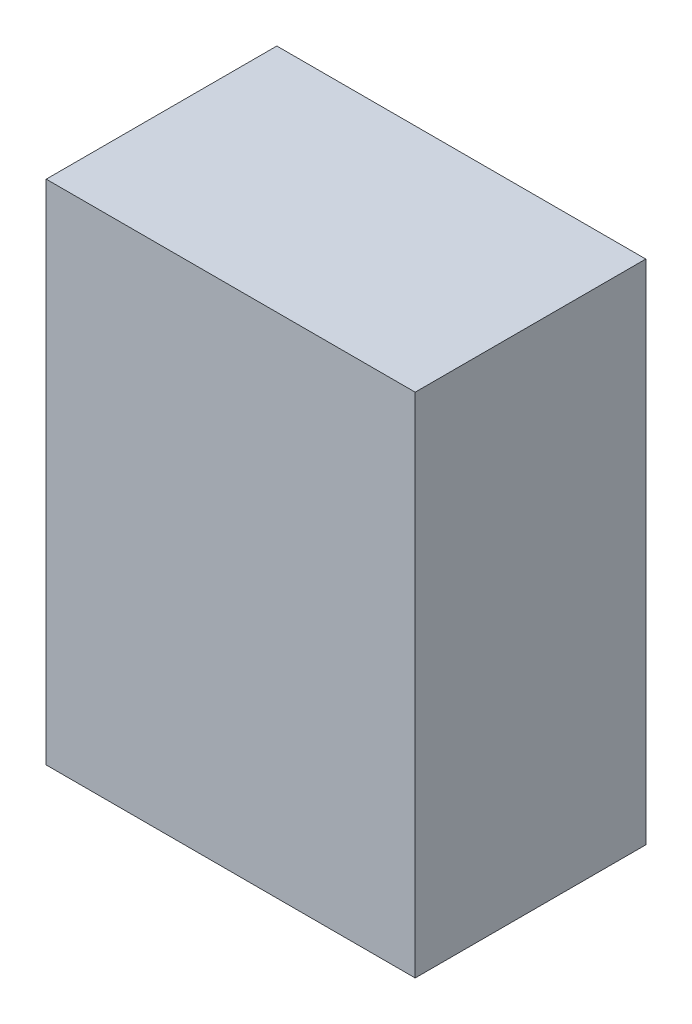
ISO-10303-21;
HEADER;
FILE_DESCRIPTION(('STEP AP214'),'2;1');
FILE_NAME('part.step','',(''),(''),'','','');
FILE_SCHEMA(('AUTOMOTIVE_DESIGN { 1 0 10303 214 1 1 1 1 }'));
ENDSEC;
DATA;
#1=APPLICATION_CONTEXT('core data for automotive mechanical design processes');
#2=APPLICATION_PROTOCOL_DEFINITION('international standard','automotive_design',2000,#1);
#3=PRODUCT_CONTEXT('',#1,'mechanical');
#4=PRODUCT('Part','Part','',(#3));
#5=PRODUCT_RELATED_PRODUCT_CATEGORY('part','',(#4));
#6=PRODUCT_DEFINITION_FORMATION('','',#4);
#7=PRODUCT_DEFINITION_CONTEXT('part definition',#1,'design');
#8=PRODUCT_DEFINITION('design','',#6,#7);
#9=PRODUCT_DEFINITION_SHAPE('','',#8);
#10=(LENGTH_UNIT() NAMED_UNIT(*) SI_UNIT(.MILLI.,.METRE.));
#11=(NAMED_UNIT(*) PLANE_ANGLE_UNIT() SI_UNIT($,.RADIAN.));
#12=(NAMED_UNIT(*) SI_UNIT($,.STERADIAN.) SOLID_ANGLE_UNIT());
#13=UNCERTAINTY_MEASURE_WITH_UNIT(LENGTH_MEASURE(1.E-05),#10,'distance_accuracy_value','');
#14=(GEOMETRIC_REPRESENTATION_CONTEXT(3) GLOBAL_UNCERTAINTY_ASSIGNED_CONTEXT((#13)) GLOBAL_UNIT_ASSIGNED_CONTEXT((#10,
#11,#12)) REPRESENTATION_CONTEXT('',''));
#15=CARTESIAN_POINT('',(0.,0.,0.));
#16=DIRECTION('',(0.,0.,1.));
#17=DIRECTION('',(1.,0.,0.));
#18=AXIS2_PLACEMENT_3D('',#15,#16,#17);
#19=CARTESIAN_POINT('',(-0.7999984,1.10000034,1.00000054));
#20=DIRECTION('',(0.,0.,1.));
#21=DIRECTION('',(1.,0.,0.));
#22=AXIS2_PLACEMENT_3D('',#19,#20,#21);
#23=PLANE('',#22);
#24=DIRECTION('',(0.,1.,0.));
#25=VECTOR('',#24,1.);
#26=CARTESIAN_POINT('',(0.80000094,1.10000034,1.00000054));
#27=LINE('',#26,#25);
#28=CARTESIAN_POINT('',(0.80000094,1.10000034,1.00000054));
#29=VERTEX_POINT('',#28);
#30=CARTESIAN_POINT('',(0.80000094,-1.10000034,1.00000054));
#31=VERTEX_POINT('',#30);
#32=EDGE_CURVE('E51',#29,#31,#27,.F.);
#33=ORIENTED_EDGE('',*,*,#32,.F.);
#34=DIRECTION('',(1.,0.,0.));
#35=VECTOR('',#34,1.);
#36=CARTESIAN_POINT('',(-0.7999984,1.10000034,1.00000054));
#37=LINE('',#36,#35);
#38=CARTESIAN_POINT('',(-0.7999984,1.10000034,1.00000054));
#39=VERTEX_POINT('',#38);
#40=EDGE_CURVE('E18',#29,#39,#37,.F.);
#41=ORIENTED_EDGE('',*,*,#40,.T.);
#42=DIRECTION('',(0.,1.,0.));
#43=VECTOR('',#42,1.);
#44=CARTESIAN_POINT('',(-0.7999984,-1.10000034,1.00000054));
#45=LINE('',#44,#43);
#46=CARTESIAN_POINT('',(-0.7999984,-1.10000034,1.00000054));
#47=VERTEX_POINT('',#46);
#48=EDGE_CURVE('E65',#47,#39,#45,.T.);
#49=ORIENTED_EDGE('',*,*,#48,.F.);
#50=DIRECTION('',(1.,0.,0.));
#51=VECTOR('',#50,1.);
#52=CARTESIAN_POINT('',(0.80000094,-1.10000034,1.00000054));
#53=LINE('',#52,#51);
#54=EDGE_CURVE('E56',#31,#47,#53,.F.);
#55=ORIENTED_EDGE('',*,*,#54,.F.);
#56=EDGE_LOOP('',(#33,#41,#49,#55));
#57=FACE_BOUND('',#56,.T.);
#58=ADVANCED_FACE('F15',(#57),#23,.T.);
#59=CARTESIAN_POINT('',(-0.7999984,-1.10000034,0.));
#60=DIRECTION('',(-1.,0.,0.));
#61=DIRECTION('',(0.,0.,1.));
#62=AXIS2_PLACEMENT_3D('',#59,#60,#61);
#63=PLANE('',#62);
#64=DIRECTION('',(0.,0.,1.));
#65=VECTOR('',#64,1.);
#66=CARTESIAN_POINT('',(-0.7999984,1.10000034,0.));
#67=LINE('',#66,#65);
#68=CARTESIAN_POINT('',(-0.7999984,1.10000034,0.));
#69=VERTEX_POINT('',#68);
#70=EDGE_CURVE('E78',#69,#39,#67,.T.);
#71=ORIENTED_EDGE('',*,*,#70,.F.);
#72=DIRECTION('',(0.,1.,0.));
#73=VECTOR('',#72,1.);
#74=CARTESIAN_POINT('',(-0.7999984,1.10000034,0.));
#75=LINE('',#74,#73);
#76=CARTESIAN_POINT('',(-0.7999984,-1.10000034,0.));
#77=VERTEX_POINT('',#76);
#78=EDGE_CURVE('E73',#69,#77,#75,.F.);
#79=ORIENTED_EDGE('',*,*,#78,.T.);
#80=DIRECTION('',(0.,0.,-1.));
#81=VECTOR('',#80,1.);
#82=CARTESIAN_POINT('',(-0.7999984,-1.10000034,0.));
#83=LINE('',#82,#81);
#84=EDGE_CURVE('E61',#47,#77,#83,.T.);
#85=ORIENTED_EDGE('',*,*,#84,.F.);
#86=ORIENTED_EDGE('',*,*,#48,.T.);
#87=EDGE_LOOP('',(#71,#79,#85,#86));
#88=FACE_BOUND('',#87,.T.);
#89=ADVANCED_FACE('F72',(#88),#63,.T.);
#90=CARTESIAN_POINT('',(0.80000094,-1.10000034,0.));
#91=DIRECTION('',(0.,-1.,0.));
#92=DIRECTION('',(0.,0.,-1.));
#93=AXIS2_PLACEMENT_3D('',#90,#91,#92);
#94=PLANE('',#93);
#95=ORIENTED_EDGE('',*,*,#84,.T.);
#96=DIRECTION('',(1.,0.,0.));
#97=VECTOR('',#96,1.);
#98=CARTESIAN_POINT('',(-0.7999984,-1.10000034,0.));
#99=LINE('',#98,#97);
#100=CARTESIAN_POINT('',(0.80000094,-1.10000034,0.));
#101=VERTEX_POINT('',#100);
#102=EDGE_CURVE('E82',#77,#101,#99,.T.);
#103=ORIENTED_EDGE('',*,*,#102,.T.);
#104=DIRECTION('',(0.,0.,-1.));
#105=VECTOR('',#104,1.);
#106=CARTESIAN_POINT('',(0.80000094,-1.10000034,0.));
#107=LINE('',#106,#105);
#108=EDGE_CURVE('E63',#31,#101,#107,.T.);
#109=ORIENTED_EDGE('',*,*,#108,.F.);
#110=ORIENTED_EDGE('',*,*,#54,.T.);
#111=EDGE_LOOP('',(#95,#103,#109,#110));
#112=FACE_BOUND('',#111,.T.);
#113=ADVANCED_FACE('F58',(#112),#94,.T.);
#114=CARTESIAN_POINT('',(0.80000094,1.10000034,0.));
#115=DIRECTION('',(1.,0.,0.));
#116=DIRECTION('',(0.,0.,-1.));
#117=AXIS2_PLACEMENT_3D('',#114,#115,#116);
#118=PLANE('',#117);
#119=ORIENTED_EDGE('',*,*,#108,.T.);
#120=DIRECTION('',(0.,1.,0.));
#121=VECTOR('',#120,1.);
#122=CARTESIAN_POINT('',(0.80000094,1.10000034,0.));
#123=LINE('',#122,#121);
#124=CARTESIAN_POINT('',(0.80000094,1.10000034,0.));
#125=VERTEX_POINT('',#124);
#126=EDGE_CURVE('E24',#101,#125,#123,.T.);
#127=ORIENTED_EDGE('',*,*,#126,.T.);
#128=DIRECTION('',(0.,0.,1.));
#129=VECTOR('',#128,1.);
#130=CARTESIAN_POINT('',(0.80000094,1.10000034,0.));
#131=LINE('',#130,#129);
#132=EDGE_CURVE('E32',#29,#125,#131,.F.);
#133=ORIENTED_EDGE('',*,*,#132,.F.);
#134=ORIENTED_EDGE('',*,*,#32,.T.);
#135=EDGE_LOOP('',(#119,#127,#133,#134));
#136=FACE_BOUND('',#135,.T.);
#137=ADVANCED_FACE('F86',(#136),#118,.T.);
#138=CARTESIAN_POINT('',(-0.7999984,1.10000034,0.));
#139=DIRECTION('',(0.,1.,0.));
#140=DIRECTION('',(0.,0.,1.));
#141=AXIS2_PLACEMENT_3D('',#138,#139,#140);
#142=PLANE('',#141);
#143=ORIENTED_EDGE('',*,*,#132,.T.);
#144=DIRECTION('',(1.,0.,0.));
#145=VECTOR('',#144,1.);
#146=CARTESIAN_POINT('',(-0.7999984,1.10000034,0.));
#147=LINE('',#146,#145);
#148=EDGE_CURVE('E10',#125,#69,#147,.F.);
#149=ORIENTED_EDGE('',*,*,#148,.T.);
#150=ORIENTED_EDGE('',*,*,#70,.T.);
#151=ORIENTED_EDGE('',*,*,#40,.F.);
#152=EDGE_LOOP('',(#143,#149,#150,#151));
#153=FACE_BOUND('',#152,.T.);
#154=ADVANCED_FACE('F89',(#153),#142,.T.);
#155=CARTESIAN_POINT('',(-0.7999984,1.10000034,0.));
#156=DIRECTION('',(0.,0.,1.));
#157=DIRECTION('',(1.,0.,0.));
#158=AXIS2_PLACEMENT_3D('',#155,#156,#157);
#159=PLANE('',#158);
#160=ORIENTED_EDGE('',*,*,#126,.F.);
#161=ORIENTED_EDGE('',*,*,#102,.F.);
#162=ORIENTED_EDGE('',*,*,#78,.F.);
#163=ORIENTED_EDGE('',*,*,#148,.F.);
#164=EDGE_LOOP('',(#160,#161,#162,#163));
#165=FACE_BOUND('',#164,.T.);
#166=ADVANCED_FACE('F88',(#165),#159,.F.);
#167=CLOSED_SHELL('',(#58,#89,#113,#137,#154,#166));
#168=MANIFOLD_SOLID_BREP('B1',#167);
#169=ADVANCED_BREP_SHAPE_REPRESENTATION('',(#18,#168),#14);
#170=SHAPE_DEFINITION_REPRESENTATION(#9,#169);
ENDSEC;
END-ISO-10303-21;
